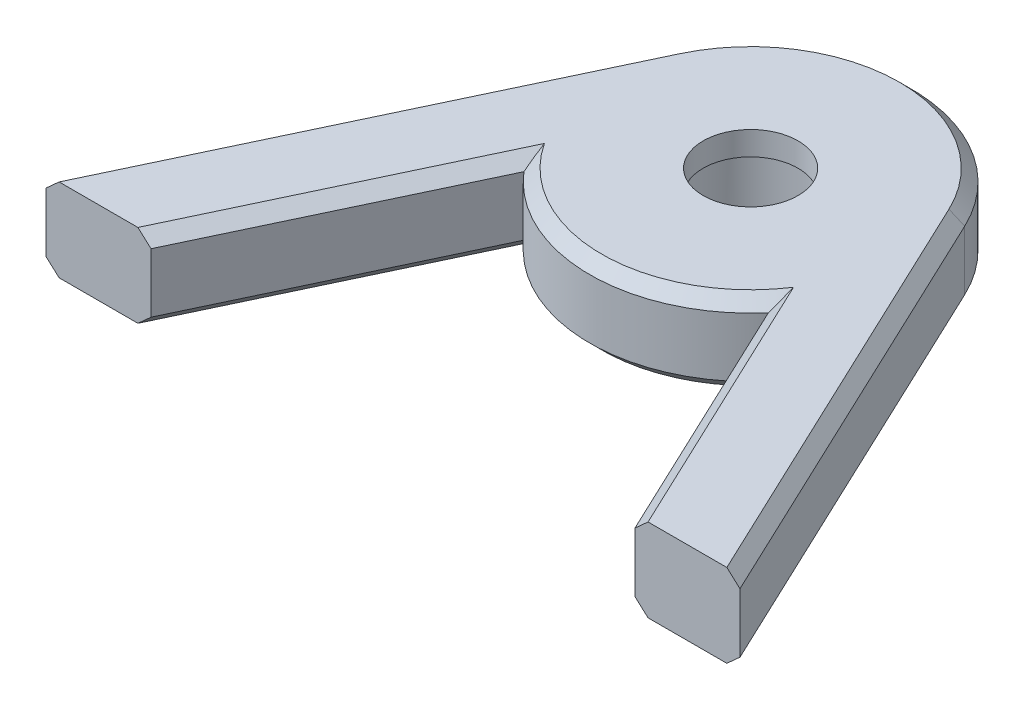
ISO-10303-21;
HEADER;
FILE_DESCRIPTION(('STEP AP214'),'2;1');
FILE_NAME('part.step','',(''),(''),'','','');
FILE_SCHEMA(('AUTOMOTIVE_DESIGN { 1 0 10303 214 1 1 1 1 }'));
ENDSEC;
DATA;
#1=APPLICATION_CONTEXT('core data for automotive mechanical design processes');
#2=APPLICATION_PROTOCOL_DEFINITION('international standard','automotive_design',2000,#1);
#3=PRODUCT_CONTEXT('',#1,'mechanical');
#4=PRODUCT('Part','Part','',(#3));
#5=PRODUCT_RELATED_PRODUCT_CATEGORY('part','',(#4));
#6=PRODUCT_DEFINITION_FORMATION('','',#4);
#7=PRODUCT_DEFINITION_CONTEXT('part definition',#1,'design');
#8=PRODUCT_DEFINITION('design','',#6,#7);
#9=PRODUCT_DEFINITION_SHAPE('','',#8);
#10=(LENGTH_UNIT() NAMED_UNIT(*) SI_UNIT(.MILLI.,.METRE.));
#11=(NAMED_UNIT(*) PLANE_ANGLE_UNIT() SI_UNIT($,.RADIAN.));
#12=(NAMED_UNIT(*) SI_UNIT($,.STERADIAN.) SOLID_ANGLE_UNIT());
#13=UNCERTAINTY_MEASURE_WITH_UNIT(LENGTH_MEASURE(1.E-05),#10,'distance_accuracy_value','');
#14=(GEOMETRIC_REPRESENTATION_CONTEXT(3) GLOBAL_UNCERTAINTY_ASSIGNED_CONTEXT((#13)) GLOBAL_UNIT_ASSIGNED_CONTEXT((#10,
#11,#12)) REPRESENTATION_CONTEXT('',''));
#15=CARTESIAN_POINT('',(0.,0.,0.));
#16=DIRECTION('',(0.,0.,1.));
#17=DIRECTION('',(1.,0.,0.));
#18=AXIS2_PLACEMENT_3D('',#15,#16,#17);
#19=CARTESIAN_POINT('',(0.,-1.,-30.15));
#20=DIRECTION('',(0.,-1.,0.));
#21=DIRECTION('',(0.,0.,-1.));
#22=AXIS2_PLACEMENT_3D('',#19,#20,#21);
#23=PLANE('',#22);
#24=CARTESIAN_POINT('',(0.,-1.,-30.15));
#25=DIRECTION('',(0.,-1.,0.));
#26=DIRECTION('',(0.,0.,-1.));
#27=AXIS2_PLACEMENT_3D('',#24,#25,#26);
#28=CIRCLE('',#27,10.);
#29=CARTESIAN_POINT('',(0.,-1.,-40.15));
#30=VERTEX_POINT('',#29);
#31=EDGE_CURVE('E281',#30,#30,#28,.T.);
#32=ORIENTED_EDGE('',*,*,#31,.F.);
#33=EDGE_LOOP('',(#32));
#34=FACE_BOUND('',#33,.T.);
#35=DIRECTION('',(0.427467380034866,0.,0.904030773262795));
#36=VECTOR('',#35,1.);
#37=CARTESIAN_POINT('',(29.3607280230666,-1.,2.57197430054442));
#38=LINE('',#37,#36);
#39=CARTESIAN_POINT('',(11.3504906025185,-1.,-35.5170346446918));
#40=VERTEX_POINT('',#39);
#41=CARTESIAN_POINT('',(28.1445801348673,-1.,0.));
#42=VERTEX_POINT('',#41);
#43=EDGE_CURVE('E339',#40,#42,#38,.T.);
#44=ORIENTED_EDGE('',*,*,#43,.T.);
#45=DIRECTION('',(-1.,0.,0.));
#46=VECTOR('',#45,1.);
#47=CARTESIAN_POINT('',(0.,-1.,0.));
#48=LINE('',#47,#46);
#49=CARTESIAN_POINT('',(21.5022350897017,-1.,0.));
#50=VERTEX_POINT('',#49);
#51=EDGE_CURVE('E565',#42,#50,#48,.T.);
#52=ORIENTED_EDGE('',*,*,#51,.T.);
#53=DIRECTION('',(-0.427467380034866,0.,-0.904030773262795));
#54=VECTOR('',#53,1.);
#55=CARTESIAN_POINT('',(11.2083510693799,-1.,-21.7700539629714));
#56=LINE('',#55,#54);
#57=CARTESIAN_POINT('',(10.5005651892905,-1.,-23.2669172240454));
#58=VERTEX_POINT('',#57);
#59=EDGE_CURVE('E349',#50,#58,#56,.T.);
#60=ORIENTED_EDGE('',*,*,#59,.T.);
#61=CARTESIAN_POINT('',(0.,-1.,-30.15));
#62=DIRECTION('',(0.,-1.,0.));
#63=DIRECTION('',(0.,0.,-1.));
#64=AXIS2_PLACEMENT_3D('',#61,#62,#63);
#65=CIRCLE('',#64,12.5554250344296);
#66=CARTESIAN_POINT('',(-10.5005651892905,-1.,-23.2669172240454));
#67=VERTEX_POINT('',#66);
#68=EDGE_CURVE('E346',#58,#67,#65,.T.);
#69=ORIENTED_EDGE('',*,*,#68,.T.);
#70=DIRECTION('',(-0.427467380034866,0.,0.904030773262795));
#71=VECTOR('',#70,1.);
#72=CARTESIAN_POINT('',(-21.3001088276339,-1.,-0.427467380034858));
#73=LINE('',#72,#71);
#74=CARTESIAN_POINT('',(-21.5022350897017,-1.,0.));
#75=VERTEX_POINT('',#74);
#76=EDGE_CURVE('E343',#67,#75,#73,.T.);
#77=ORIENTED_EDGE('',*,*,#76,.T.);
#78=CARTESIAN_POINT('',(-28.1445801348673,-1.,0.));
#79=VERTEX_POINT('',#78);
#80=EDGE_CURVE('E70',#75,#79,#48,.T.);
#81=ORIENTED_EDGE('',*,*,#80,.T.);
#82=DIRECTION('',(0.427467380034866,0.,-0.904030773262795));
#83=VECTOR('',#82,1.);
#84=CARTESIAN_POINT('',(-11.3504906025185,-1.,-35.5170346446918));
#85=LINE('',#84,#83);
#86=CARTESIAN_POINT('',(-11.3504906025185,-1.,-35.5170346446918));
#87=VERTEX_POINT('',#86);
#88=EDGE_CURVE('E333',#79,#87,#85,.T.);
#89=ORIENTED_EDGE('',*,*,#88,.T.);
#90=CARTESIAN_POINT('',(0.,-1.,-30.15));
#91=DIRECTION('',(0.,-1.,0.));
#92=DIRECTION('',(0.,0.,-1.));
#93=AXIS2_PLACEMENT_3D('',#90,#91,#92);
#94=CIRCLE('',#93,12.5554250344296);
#95=EDGE_CURVE('E336',#87,#40,#94,.T.);
#96=ORIENTED_EDGE('',*,*,#95,.T.);
#97=EDGE_LOOP('',(#44,#52,#60,#69,#77,#81,#89,#96));
#98=FACE_BOUND('',#97,.T.);
#99=ADVANCED_FACE('F46',(#34,#98),#23,.T.);
#100=CARTESIAN_POINT('',(-30.2647587963294,-1.,2.14450692050956));
#101=DIRECTION('',(0.904030773262795,0.,0.427467380034866));
#102=DIRECTION('',(0.427467380034866,0.,-0.904030773262795));
#103=AXIS2_PLACEMENT_3D('',#100,#101,#102);
#104=PLANE('',#103);
#105=DIRECTION('',(0.,-1.,0.));
#106=VECTOR('',#105,1.);
#107=CARTESIAN_POINT('',(-29.2507371701979,-1.,0.));
#108=LINE('',#107,#106);
#109=CARTESIAN_POINT('',(-29.2507371701979,4.99999999999999,0.));
#110=VERTEX_POINT('',#109);
#111=CARTESIAN_POINT('',(-29.2507371701979,0.,0.));
#112=VERTEX_POINT('',#111);
#113=EDGE_CURVE('E519',#110,#112,#108,.T.);
#114=ORIENTED_EDGE('',*,*,#113,.F.);
#115=DIRECTION('',(0.427467380034866,0.,-0.904030773262795));
#116=VECTOR('',#115,1.);
#117=CARTESIAN_POINT('',(-12.2545213757813,4.99999999999999,-35.9445020247267));
#118=LINE('',#117,#116);
#119=CARTESIAN_POINT('',(-12.2545213757813,4.99999999999999,-35.9445020247267));
#120=VERTEX_POINT('',#119);
#121=EDGE_CURVE('E446',#110,#120,#118,.T.);
#122=ORIENTED_EDGE('',*,*,#121,.T.);
#123=DIRECTION('',(0.,1.,0.));
#124=VECTOR('',#123,1.);
#125=CARTESIAN_POINT('',(-12.2545213757813,-1.,-35.9445020247267));
#126=LINE('',#125,#124);
#127=CARTESIAN_POINT('',(-12.2545213757813,0.,-35.9445020247267));
#128=VERTEX_POINT('',#127);
#129=EDGE_CURVE('E184',#128,#120,#126,.T.);
#130=ORIENTED_EDGE('',*,*,#129,.F.);
#131=DIRECTION('',(-0.427467380034866,0.,0.904030773262795));
#132=VECTOR('',#131,1.);
#133=CARTESIAN_POINT('',(-30.2647587963294,0.,2.14450692050955));
#134=LINE('',#133,#132);
#135=EDGE_CURVE('E329',#128,#112,#134,.T.);
#136=ORIENTED_EDGE('',*,*,#135,.T.);
#137=EDGE_LOOP('',(#114,#122,#130,#136));
#138=FACE_BOUND('',#137,.T.);
#139=ADVANCED_FACE('F243',(#138),#104,.F.);
#140=CARTESIAN_POINT('',(30.2647587963294,-1.,2.14450692050956));
#141=DIRECTION('',(-0.904030773262795,0.,0.427467380034866));
#142=DIRECTION('',(0.427467380034866,0.,0.904030773262795));
#143=AXIS2_PLACEMENT_3D('',#140,#141,#142);
#144=PLANE('',#143);
#145=DIRECTION('',(0.,1.,0.));
#146=VECTOR('',#145,1.);
#147=CARTESIAN_POINT('',(29.2507371701979,-1.,0.));
#148=LINE('',#147,#146);
#149=CARTESIAN_POINT('',(29.2507371701979,0.,0.));
#150=VERTEX_POINT('',#149);
#151=CARTESIAN_POINT('',(29.2507371701979,5.,0.));
#152=VERTEX_POINT('',#151);
#153=EDGE_CURVE('E276',#150,#152,#148,.T.);
#154=ORIENTED_EDGE('',*,*,#153,.F.);
#155=DIRECTION('',(-0.427467380034866,0.,-0.904030773262795));
#156=VECTOR('',#155,1.);
#157=CARTESIAN_POINT('',(12.2545213757813,0.,-35.9445020247267));
#158=LINE('',#157,#156);
#159=CARTESIAN_POINT('',(12.2545213757813,0.,-35.9445020247267));
#160=VERTEX_POINT('',#159);
#161=EDGE_CURVE('E191',#150,#160,#158,.T.);
#162=ORIENTED_EDGE('',*,*,#161,.T.);
#163=DIRECTION('',(0.,1.,0.));
#164=VECTOR('',#163,1.);
#165=CARTESIAN_POINT('',(12.2545213757813,-1.,-35.9445020247267));
#166=LINE('',#165,#164);
#167=CARTESIAN_POINT('',(12.2545213757813,4.99999999999999,-35.9445020247267));
#168=VERTEX_POINT('',#167);
#169=EDGE_CURVE('E313',#160,#168,#166,.T.);
#170=ORIENTED_EDGE('',*,*,#169,.T.);
#171=DIRECTION('',(0.427467380034866,0.,0.904030773262795));
#172=VECTOR('',#171,1.);
#173=CARTESIAN_POINT('',(29.2507371701979,4.99999999999999,0.));
#174=LINE('',#173,#172);
#175=EDGE_CURVE('E447',#168,#152,#174,.T.);
#176=ORIENTED_EDGE('',*,*,#175,.T.);
#177=EDGE_LOOP('',(#154,#162,#170,#176));
#178=FACE_BOUND('',#177,.T.);
#179=ADVANCED_FACE('F251',(#178),#144,.F.);
#180=CARTESIAN_POINT('',(11.3504906025185,-1.,-35.5170346446918));
#181=DIRECTION('',(0.639246290175441,-0.707106781186547,-0.302265083158701));
#182=DIRECTION('',(-0.427467380034866,0.,-0.904030773262795));
#183=AXIS2_PLACEMENT_3D('',#180,#181,#182);
#184=PLANE('',#183);
#185=ORIENTED_EDGE('',*,*,#161,.F.);
#186=DIRECTION('',(-0.741805545341281,-0.670615040765508,0.));
#187=VECTOR('',#186,1.);
#188=CARTESIAN_POINT('',(18.9032046729504,-9.35448780484863,0.));
#189=LINE('',#188,#187);
#190=EDGE_CURVE('E283',#150,#42,#189,.T.);
#191=ORIENTED_EDGE('',*,*,#190,.T.);
#192=ORIENTED_EDGE('',*,*,#43,.F.);
#193=DIRECTION('',(-0.639246290175441,-0.707106781186548,0.3022650831587));
#194=VECTOR('',#193,1.);
#195=CARTESIAN_POINT('',(12.2545213757813,0.,-35.9445020247267));
#196=LINE('',#195,#194);
#197=EDGE_CURVE('E206',#160,#40,#196,.T.);
#198=ORIENTED_EDGE('',*,*,#197,.F.);
#199=EDGE_LOOP('',(#185,#191,#192,#198));
#200=FACE_BOUND('',#199,.T.);
#201=ADVANCED_FACE('F416',(#200),#184,.T.);
#202=CARTESIAN_POINT('',(-11.3504906025185,-1.,-35.5170346446918));
#203=DIRECTION('',(-0.639246290175441,-0.707106781186547,-0.302265083158701));
#204=DIRECTION('',(-0.427467380034866,0.,0.904030773262795));
#205=AXIS2_PLACEMENT_3D('',#202,#203,#204);
#206=PLANE('',#205);
#207=ORIENTED_EDGE('',*,*,#88,.F.);
#208=DIRECTION('',(-0.741805545341281,0.670615040765508,0.));
#209=VECTOR('',#208,1.);
#210=CARTESIAN_POINT('',(-18.9032046729504,-9.35448780484863,0.));
#211=LINE('',#210,#209);
#212=EDGE_CURVE('E525',#79,#112,#211,.T.);
#213=ORIENTED_EDGE('',*,*,#212,.T.);
#214=ORIENTED_EDGE('',*,*,#135,.F.);
#215=DIRECTION('',(0.63924629017544,-0.707106781186548,0.3022650831587));
#216=VECTOR('',#215,1.);
#217=CARTESIAN_POINT('',(-12.2545213757813,0.,-35.9445020247267));
#218=LINE('',#217,#216);
#219=EDGE_CURVE('E202',#128,#87,#218,.T.);
#220=ORIENTED_EDGE('',*,*,#219,.T.);
#221=EDGE_LOOP('',(#207,#213,#214,#220));
#222=FACE_BOUND('',#221,.T.);
#223=ADVANCED_FACE('F411',(#222),#206,.T.);
#224=CARTESIAN_POINT('',(5.92189038061173,-1.,-32.9501424738203));
#225=DIRECTION('',(-0.639246290175445,-0.707106781186543,0.302265083158703));
#226=DIRECTION('',(0.427467380034866,0.,0.904030773262795));
#227=AXIS2_PLACEMENT_3D('',#224,#225,#226);
#228=PLANE('',#227);
#229=ORIENTED_EDGE('',*,*,#59,.F.);
#230=DIRECTION('',(-0.741805545341277,0.670615040765513,0.));
#231=VECTOR('',#230,1.);
#232=CARTESIAN_POINT('',(12.9287536273427,6.75069107597076,0.));
#233=LINE('',#232,#231);
#234=CARTESIAN_POINT('',(20.3960780543712,0.,0.));
#235=VERTEX_POINT('',#234);
#236=EDGE_CURVE('E524',#50,#235,#233,.T.);
#237=ORIENTED_EDGE('',*,*,#236,.T.);
#238=DIRECTION('',(0.427467380034866,0.,0.904030773262795));
#239=VECTOR('',#238,1.);
#240=CARTESIAN_POINT('',(20.3960780543712,0.,0.));
#241=LINE('',#240,#239);
#242=CARTESIAN_POINT('',(10.3043202961172,0.,-21.3425865829366));
#243=VERTEX_POINT('',#242);
#244=EDGE_CURVE('E11',#243,#235,#241,.T.);
#245=ORIENTED_EDGE('',*,*,#244,.F.);
#246=CARTESIAN_POINT('',(10.3043202961172,0.,-21.3425865829366));
#247=CARTESIAN_POINT('',(10.3254338543777,-0.0866665754563658,-21.5006788075415));
#248=CARTESIAN_POINT('',(10.3454332905183,-0.172569648524016,-21.6593411301335));
#249=CARTESIAN_POINT('',(10.3830859963499,-0.342722987591227,-21.9777610626386));
#250=CARTESIAN_POINT('',(10.4007399999005,-0.426973763509953,-22.1375183134307));
#251=CARTESIAN_POINT('',(10.4335978145244,-0.593753792612386,-22.4581873514497));
#252=CARTESIAN_POINT('',(10.4488015491824,-0.676282992036298,-22.6190991745202));
#253=CARTESIAN_POINT('',(10.4766415478909,-0.83953276082195,-22.9421216077507));
#254=CARTESIAN_POINT('',(10.489277004891,-0.920252754594745,-23.1042325781944));
#255=CARTESIAN_POINT('',(10.5005651892905,-1.,-23.2669172240454));
#256=B_SPLINE_CURVE_WITH_KNOTS('',3,(#246,#247,#248,#249,#250,#251,#252,#253,#254,#255),
.UNSPECIFIED.,.F.,.F.,(4,2,2,2,4),(0.,0.544561813912758,1.08895283723208,1.63336083491792,
2.17793964271018),.UNSPECIFIED.);
#257=EDGE_CURVE('E52',#58,#243,#256,.F.);
#258=ORIENTED_EDGE('',*,*,#257,.F.);
#259=EDGE_LOOP('',(#229,#237,#245,#258));
#260=FACE_BOUND('',#259,.T.);
#261=ADVANCED_FACE('F49',(#260),#228,.T.);
#262=CARTESIAN_POINT('',(-5.92189038061173,-1.,-32.9501424738203));
#263=DIRECTION('',(0.639246290175445,-0.707106781186543,0.302265083158703));
#264=DIRECTION('',(0.427467380034866,0.,-0.904030773262795));
#265=AXIS2_PLACEMENT_3D('',#262,#263,#264);
#266=PLANE('',#265);
#267=DIRECTION('',(0.427467380034866,0.,-0.904030773262795));
#268=VECTOR('',#267,1.);
#269=CARTESIAN_POINT('',(-10.3043202961172,0.,-21.3425865829366));
#270=LINE('',#269,#268);
#271=CARTESIAN_POINT('',(-20.3960780543712,0.,0.));
#272=VERTEX_POINT('',#271);
#273=CARTESIAN_POINT('',(-10.3043202961171,0.,-21.3425865829365));
#274=VERTEX_POINT('',#273);
#275=EDGE_CURVE('E178',#272,#274,#270,.T.);
#276=ORIENTED_EDGE('',*,*,#275,.F.);
#277=DIRECTION('',(-0.741805545341277,-0.670615040765513,0.));
#278=VECTOR('',#277,1.);
#279=CARTESIAN_POINT('',(-12.9287536273427,6.75069107597076,0.));
#280=LINE('',#279,#278);
#281=EDGE_CURVE('E165',#272,#75,#280,.T.);
#282=ORIENTED_EDGE('',*,*,#281,.T.);
#283=ORIENTED_EDGE('',*,*,#76,.F.);
#284=CARTESIAN_POINT('',(-10.3043202961171,0.,-21.3425865829365));
#285=CARTESIAN_POINT('',(-10.3254338543777,-0.086666575456364,-21.5006788075415));
#286=CARTESIAN_POINT('',(-10.3454332905183,-0.172569648524014,-21.6593411301335));
#287=CARTESIAN_POINT('',(-10.3830859963499,-0.342722987591224,-21.9777610626386));
#288=CARTESIAN_POINT('',(-10.4007399999005,-0.426973763509951,-22.1375183134307));
#289=CARTESIAN_POINT('',(-10.4335978145244,-0.593753792612384,-22.4581873514497));
#290=CARTESIAN_POINT('',(-10.4488015491824,-0.676282992036297,-22.6190991745202));
#291=CARTESIAN_POINT('',(-10.4766415478909,-0.83953276082195,-22.9421216077507));
#292=CARTESIAN_POINT('',(-10.489277004891,-0.920252754594746,-23.1042325781944));
#293=CARTESIAN_POINT('',(-10.5005651892905,-1.,-23.2669172240454));
#294=B_SPLINE_CURVE_WITH_KNOTS('',3,(#284,#285,#286,#287,#288,#289,#290,#291,#292,#293),
.UNSPECIFIED.,.F.,.F.,(4,2,2,2,4),(0.,0.544561813912757,1.08895283723209,1.63336083491793,
2.17793964271019),.UNSPECIFIED.);
#295=EDGE_CURVE('E189',#67,#274,#294,.F.);
#296=ORIENTED_EDGE('',*,*,#295,.T.);
#297=EDGE_LOOP('',(#276,#282,#283,#296));
#298=FACE_BOUND('',#297,.T.);
#299=ADVANCED_FACE('F187',(#298),#266,.T.);
#300=CARTESIAN_POINT('',(0.,-1.,-30.15));
#301=DIRECTION('',(0.,-1.,0.));
#302=DIRECTION('',(0.,0.,-1.));
#303=AXIS2_PLACEMENT_3D('',#300,#301,#302);
#304=CIRCLE('',#303,5.);
#305=CARTESIAN_POINT('',(0.,-1.,-35.15));
#306=VERTEX_POINT('',#305);
#307=EDGE_CURVE('E269',#306,#306,#304,.T.);
#308=ORIENTED_EDGE('',*,*,#307,.F.);
#309=EDGE_LOOP('',(#308));
#310=FACE_BOUND('',#309,.T.);
#311=CARTESIAN_POINT('',(0.,-1.,-30.15));
#312=DIRECTION('',(0.,-1.,0.));
#313=DIRECTION('',(0.,0.,-1.));
#314=AXIS2_PLACEMENT_3D('',#311,#312,#313);
#315=CIRCLE('',#314,6.);
#316=CARTESIAN_POINT('',(0.,-1.,-36.15));
#317=VERTEX_POINT('',#316);
#318=EDGE_CURVE('E272',#317,#317,#315,.T.);
#319=ORIENTED_EDGE('',*,*,#318,.T.);
#320=EDGE_LOOP('',(#319));
#321=FACE_BOUND('',#320,.T.);
#322=ADVANCED_FACE('F246',(#310,#321),#23,.T.);
#323=CARTESIAN_POINT('',(0.,-1.,-30.15));
#324=DIRECTION('',(0.,1.,0.));
#325=DIRECTION('',(0.,0.,1.));
#326=AXIS2_PLACEMENT_3D('',#323,#324,#325);
#327=CYLINDRICAL_SURFACE('',#326,5.);
#328=ORIENTED_EDGE('',*,*,#307,.T.);
#329=EDGE_LOOP('',(#328));
#330=FACE_BOUND('',#329,.T.);
#331=CARTESIAN_POINT('',(0.,4.,-30.15));
#332=DIRECTION('',(0.,1.,0.));
#333=DIRECTION('',(0.,0.,1.));
#334=AXIS2_PLACEMENT_3D('',#331,#332,#333);
#335=CIRCLE('',#334,5.);
#336=CARTESIAN_POINT('',(0.,4.,-25.15));
#337=VERTEX_POINT('',#336);
#338=EDGE_CURVE('E310',#337,#337,#335,.T.);
#339=ORIENTED_EDGE('',*,*,#338,.T.);
#340=EDGE_LOOP('',(#339));
#341=FACE_BOUND('',#340,.T.);
#342=ADVANCED_FACE('F258',(#330,#341),#327,.F.);
#343=CARTESIAN_POINT('',(20.3960780543712,-1.,0.));
#344=DIRECTION('',(0.904030773262795,0.,-0.427467380034866));
#345=DIRECTION('',(-0.427467380034866,0.,-0.904030773262795));
#346=AXIS2_PLACEMENT_3D('',#343,#344,#345);
#347=PLANE('',#346);
#348=DIRECTION('',(0.,1.,0.));
#349=VECTOR('',#348,1.);
#350=CARTESIAN_POINT('',(10.3043202961172,-1.,-21.3425865829366));
#351=LINE('',#350,#349);
#352=CARTESIAN_POINT('',(10.3043202961172,5.00000000000001,-21.3425865829366));
#353=VERTEX_POINT('',#352);
#354=EDGE_CURVE('E320',#243,#353,#351,.T.);
#355=ORIENTED_EDGE('',*,*,#354,.F.);
#356=ORIENTED_EDGE('',*,*,#244,.T.);
#357=DIRECTION('',(0.,1.,0.));
#358=VECTOR('',#357,1.);
#359=CARTESIAN_POINT('',(20.3960780543712,-1.,0.));
#360=LINE('',#359,#358);
#361=CARTESIAN_POINT('',(20.3960780543711,5.,0.));
#362=VERTEX_POINT('',#361);
#363=EDGE_CURVE('E199',#235,#362,#360,.T.);
#364=ORIENTED_EDGE('',*,*,#363,.T.);
#365=DIRECTION('',(-0.427467380034866,0.,-0.904030773262795));
#366=VECTOR('',#365,1.);
#367=CARTESIAN_POINT('',(10.3043202961172,5.00000000000001,-21.3425865829366));
#368=LINE('',#367,#366);
#369=EDGE_CURVE('E454',#362,#353,#368,.T.);
#370=ORIENTED_EDGE('',*,*,#369,.T.);
#371=EDGE_LOOP('',(#355,#356,#364,#370));
#372=FACE_BOUND('',#371,.T.);
#373=ADVANCED_FACE('F263',(#372),#347,.F.);
#374=CARTESIAN_POINT('',(0.,-1.,-30.15));
#375=DIRECTION('',(0.,1.,0.));
#376=DIRECTION('',(0.,0.,1.));
#377=AXIS2_PLACEMENT_3D('',#374,#375,#376);
#378=CYLINDRICAL_SURFACE('',#377,13.5554250344296);
#379=DIRECTION('',(0.,1.,0.));
#380=VECTOR('',#379,1.);
#381=CARTESIAN_POINT('',(-10.3043202961171,-1.,-21.3425865829365));
#382=LINE('',#381,#380);
#383=CARTESIAN_POINT('',(-10.3043202961171,5.00000000000001,-21.3425865829365));
#384=VERTEX_POINT('',#383);
#385=EDGE_CURVE('E183',#274,#384,#382,.T.);
#386=ORIENTED_EDGE('',*,*,#385,.F.);
#387=CARTESIAN_POINT('',(0.,0.,-30.15));
#388=DIRECTION('',(0.,-1.,0.));
#389=DIRECTION('',(0.,0.,-1.));
#390=AXIS2_PLACEMENT_3D('',#387,#388,#389);
#391=CIRCLE('',#390,13.5554250344296);
#392=EDGE_CURVE('E62',#274,#243,#391,.F.);
#393=ORIENTED_EDGE('',*,*,#392,.T.);
#394=ORIENTED_EDGE('',*,*,#354,.T.);
#395=CARTESIAN_POINT('',(0.,5.00000000000001,-30.15));
#396=DIRECTION('',(0.,1.,0.));
#397=DIRECTION('',(0.,0.,1.));
#398=AXIS2_PLACEMENT_3D('',#395,#396,#397);
#399=CIRCLE('',#398,13.5554250344296);
#400=EDGE_CURVE('E484',#353,#384,#399,.F.);
#401=ORIENTED_EDGE('',*,*,#400,.T.);
#402=EDGE_LOOP('',(#386,#393,#394,#401));
#403=FACE_BOUND('',#402,.T.);
#404=ADVANCED_FACE('F600',(#403),#378,.T.);
#405=CARTESIAN_POINT('',(-20.3960780543712,-1.,0.));
#406=DIRECTION('',(-0.904030773262795,0.,-0.427467380034866));
#407=DIRECTION('',(-0.427467380034866,0.,0.904030773262795));
#408=AXIS2_PLACEMENT_3D('',#405,#406,#407);
#409=PLANE('',#408);
#410=DIRECTION('',(0.,1.,0.));
#411=VECTOR('',#410,1.);
#412=CARTESIAN_POINT('',(-20.3960780543712,-1.,0.));
#413=LINE('',#412,#411);
#414=CARTESIAN_POINT('',(-20.3960780543712,5.,0.));
#415=VERTEX_POINT('',#414);
#416=EDGE_CURVE('E168',#272,#415,#413,.T.);
#417=ORIENTED_EDGE('',*,*,#416,.F.);
#418=ORIENTED_EDGE('',*,*,#275,.T.);
#419=ORIENTED_EDGE('',*,*,#385,.T.);
#420=DIRECTION('',(-0.427467380034866,0.,0.904030773262795));
#421=VECTOR('',#420,1.);
#422=CARTESIAN_POINT('',(-20.3960780543712,5.00000000000001,0.));
#423=LINE('',#422,#421);
#424=EDGE_CURVE('E180',#384,#415,#423,.T.);
#425=ORIENTED_EDGE('',*,*,#424,.T.);
#426=EDGE_LOOP('',(#417,#418,#419,#425));
#427=FACE_BOUND('',#426,.T.);
#428=ADVANCED_FACE('F177',(#427),#409,.F.);
#429=CARTESIAN_POINT('',(0.,-1.,-30.15));
#430=DIRECTION('',(0.,1.,0.));
#431=DIRECTION('',(0.,0.,1.));
#432=AXIS2_PLACEMENT_3D('',#429,#430,#431);
#433=CYLINDRICAL_SURFACE('',#432,13.5554250344296);
#434=ORIENTED_EDGE('',*,*,#169,.F.);
#435=CARTESIAN_POINT('',(0.,0.,-30.15));
#436=DIRECTION('',(0.,-1.,0.));
#437=DIRECTION('',(0.,0.,-1.));
#438=AXIS2_PLACEMENT_3D('',#435,#436,#437);
#439=CIRCLE('',#438,13.5554250344296);
#440=EDGE_CURVE('E196',#160,#128,#439,.F.);
#441=ORIENTED_EDGE('',*,*,#440,.T.);
#442=ORIENTED_EDGE('',*,*,#129,.T.);
#443=CARTESIAN_POINT('',(0.,4.99999999999999,-30.15));
#444=DIRECTION('',(0.,1.,0.));
#445=DIRECTION('',(0.,0.,1.));
#446=AXIS2_PLACEMENT_3D('',#443,#444,#445);
#447=CIRCLE('',#446,13.5554250344296);
#448=EDGE_CURVE('E441',#120,#168,#447,.F.);
#449=ORIENTED_EDGE('',*,*,#448,.T.);
#450=EDGE_LOOP('',(#434,#441,#442,#449));
#451=FACE_BOUND('',#450,.T.);
#452=ADVANCED_FACE('F438',(#451),#433,.T.);
#453=CARTESIAN_POINT('',(0.,4.,-30.15));
#454=DIRECTION('',(0.,1.,0.));
#455=DIRECTION('',(0.,0.,1.));
#456=AXIS2_PLACEMENT_3D('',#453,#454,#455);
#457=PLANE('',#456);
#458=CARTESIAN_POINT('',(0.,4.,-30.15));
#459=DIRECTION('',(0.,1.,0.));
#460=DIRECTION('',(0.,0.,1.));
#461=AXIS2_PLACEMENT_3D('',#458,#459,#460);
#462=CIRCLE('',#461,4.);
#463=CARTESIAN_POINT('',(0.,4.,-26.15));
#464=VERTEX_POINT('',#463);
#465=EDGE_CURVE('E306',#464,#464,#462,.T.);
#466=ORIENTED_EDGE('',*,*,#465,.T.);
#467=EDGE_LOOP('',(#466));
#468=FACE_BOUND('',#467,.T.);
#469=ORIENTED_EDGE('',*,*,#338,.F.);
#470=EDGE_LOOP('',(#469));
#471=FACE_BOUND('',#470,.T.);
#472=ADVANCED_FACE('F535',(#468,#471),#457,.F.);
#473=CARTESIAN_POINT('',(0.,4.,-30.15));
#474=DIRECTION('',(0.,1.,0.));
#475=DIRECTION('',(0.,0.,1.));
#476=AXIS2_PLACEMENT_3D('',#473,#474,#475);
#477=CYLINDRICAL_SURFACE('',#476,4.);
#478=ORIENTED_EDGE('',*,*,#465,.F.);
#479=EDGE_LOOP('',(#478));
#480=FACE_BOUND('',#479,.T.);
#481=CARTESIAN_POINT('',(0.,6.,-30.15));
#482=DIRECTION('',(0.,1.,0.));
#483=DIRECTION('',(0.,0.,1.));
#484=AXIS2_PLACEMENT_3D('',#481,#482,#483);
#485=CIRCLE('',#484,4.);
#486=CARTESIAN_POINT('',(0.,6.,-26.15));
#487=VERTEX_POINT('',#486);
#488=EDGE_CURVE('E293',#487,#487,#485,.T.);
#489=ORIENTED_EDGE('',*,*,#488,.T.);
#490=EDGE_LOOP('',(#489));
#491=FACE_BOUND('',#490,.T.);
#492=ADVANCED_FACE('F537',(#480,#491),#477,.F.);
#493=CARTESIAN_POINT('',(0.,6.,-30.15));
#494=DIRECTION('',(0.,1.,0.));
#495=DIRECTION('',(0.,0.,1.));
#496=AXIS2_PLACEMENT_3D('',#493,#494,#495);
#497=PLANE('',#496);
#498=DIRECTION('',(1.,0.,0.));
#499=VECTOR('',#498,1.);
#500=CARTESIAN_POINT('',(-29.2507371701979,6.,0.));
#501=LINE('',#500,#499);
#502=CARTESIAN_POINT('',(-28.1445801348673,6.,0.));
#503=VERTEX_POINT('',#502);
#504=CARTESIAN_POINT('',(-21.5022350897017,6.,0.));
#505=VERTEX_POINT('',#504);
#506=EDGE_CURVE('E302',#503,#505,#501,.T.);
#507=ORIENTED_EDGE('',*,*,#506,.T.);
#508=DIRECTION('',(0.427467380034866,0.,-0.904030773262795));
#509=VECTOR('',#508,1.);
#510=CARTESIAN_POINT('',(-11.2083510693799,6.,-21.7700539629714));
#511=LINE('',#510,#509);
#512=CARTESIAN_POINT('',(-10.5005651892905,6.,-23.2669172240454));
#513=VERTEX_POINT('',#512);
#514=EDGE_CURVE('E478',#505,#513,#511,.T.);
#515=ORIENTED_EDGE('',*,*,#514,.T.);
#516=CARTESIAN_POINT('',(0.,6.,-30.15));
#517=DIRECTION('',(0.,1.,0.));
#518=DIRECTION('',(0.,0.,1.));
#519=AXIS2_PLACEMENT_3D('',#516,#517,#518);
#520=CIRCLE('',#519,12.5554250344296);
#521=CARTESIAN_POINT('',(10.5005651892905,6.,-23.2669172240454));
#522=VERTEX_POINT('',#521);
#523=EDGE_CURVE('E472',#513,#522,#520,.T.);
#524=ORIENTED_EDGE('',*,*,#523,.T.);
#525=DIRECTION('',(0.427467380034866,0.,0.904030773262795));
#526=VECTOR('',#525,1.);
#527=CARTESIAN_POINT('',(21.3001088276339,6.,-0.427467380034858));
#528=LINE('',#527,#526);
#529=CARTESIAN_POINT('',(21.5022350897017,6.,0.));
#530=VERTEX_POINT('',#529);
#531=EDGE_CURVE('E469',#522,#530,#528,.T.);
#532=ORIENTED_EDGE('',*,*,#531,.T.);
#533=DIRECTION('',(1.,0.,0.));
#534=VECTOR('',#533,1.);
#535=CARTESIAN_POINT('',(20.3960780543712,6.,0.));
#536=LINE('',#535,#534);
#537=CARTESIAN_POINT('',(28.1445801348673,6.,0.));
#538=VERTEX_POINT('',#537);
#539=EDGE_CURVE('E297',#530,#538,#536,.T.);
#540=ORIENTED_EDGE('',*,*,#539,.T.);
#541=DIRECTION('',(-0.427467380034866,0.,-0.904030773262795));
#542=VECTOR('',#541,1.);
#543=CARTESIAN_POINT('',(11.3504906025185,6.,-35.5170346446918));
#544=LINE('',#543,#542);
#545=CARTESIAN_POINT('',(11.3504906025185,6.,-35.5170346446918));
#546=VERTEX_POINT('',#545);
#547=EDGE_CURVE('E463',#538,#546,#544,.T.);
#548=ORIENTED_EDGE('',*,*,#547,.T.);
#549=CARTESIAN_POINT('',(0.,6.,-30.15));
#550=DIRECTION('',(0.,1.,0.));
#551=DIRECTION('',(0.,0.,1.));
#552=AXIS2_PLACEMENT_3D('',#549,#550,#551);
#553=CIRCLE('',#552,12.5554250344296);
#554=CARTESIAN_POINT('',(-11.3504906025185,6.,-35.5170346446918));
#555=VERTEX_POINT('',#554);
#556=EDGE_CURVE('E456',#546,#555,#553,.T.);
#557=ORIENTED_EDGE('',*,*,#556,.T.);
#558=DIRECTION('',(-0.427467380034866,0.,0.904030773262795));
#559=VECTOR('',#558,1.);
#560=CARTESIAN_POINT('',(-28.3467063969351,6.,0.427467380034869));
#561=LINE('',#560,#559);
#562=EDGE_CURVE('E464',#555,#503,#561,.T.);
#563=ORIENTED_EDGE('',*,*,#562,.T.);
#564=EDGE_LOOP('',(#507,#515,#524,#532,#540,#548,#557,#563));
#565=FACE_BOUND('',#564,.T.);
#566=ORIENTED_EDGE('',*,*,#488,.F.);
#567=EDGE_LOOP('',(#566));
#568=FACE_BOUND('',#567,.T.);
#569=ADVANCED_FACE('F385',(#565,#568),#497,.T.);
#570=CARTESIAN_POINT('',(5.92189038061173,6.,-32.9501424738203));
#571=DIRECTION('',(-0.639246290175445,0.707106781186543,0.302265083158703));
#572=DIRECTION('',(-0.427467380034866,0.,-0.904030773262795));
#573=AXIS2_PLACEMENT_3D('',#570,#571,#572);
#574=PLANE('',#573);
#575=DIRECTION('',(-0.741805545341277,-0.670615040765513,0.));
#576=VECTOR('',#575,1.);
#577=CARTESIAN_POINT('',(6.68528689586737,-7.39497713306703,0.));
#578=LINE('',#577,#576);
#579=EDGE_CURVE('E504',#530,#362,#578,.T.);
#580=ORIENTED_EDGE('',*,*,#579,.F.);
#581=ORIENTED_EDGE('',*,*,#531,.F.);
#582=CARTESIAN_POINT('',(10.5005651892905,6.,-23.2669172240454));
#583=CARTESIAN_POINT('',(10.489277004891,5.92025275459475,-23.1042325781944));
#584=CARTESIAN_POINT('',(10.4766415478909,5.83953276082195,-22.9421216077507));
#585=CARTESIAN_POINT('',(10.4488015491824,5.6762829920363,-22.6190991745202));
#586=CARTESIAN_POINT('',(10.4335978145244,5.59375379261239,-22.4581873514497));
#587=CARTESIAN_POINT('',(10.4007399999005,5.42697376350995,-22.1375183134307));
#588=CARTESIAN_POINT('',(10.3830859963499,5.34272298759123,-21.9777610626386));
#589=CARTESIAN_POINT('',(10.3454332905183,5.17256964852402,-21.6593411301335));
#590=CARTESIAN_POINT('',(10.3254338543777,5.08666657545637,-21.5006788075415));
#591=CARTESIAN_POINT('',(10.3043202961172,5.00000000000001,-21.3425865829366));
#592=B_SPLINE_CURVE_WITH_KNOTS('',3,(#582,#583,#584,#585,#586,#587,#588,#589,#590,#591),
.UNSPECIFIED.,.F.,.F.,(4,2,2,2,4),(0.,0.544578807792256,1.0889868054781,1.63337782879742,
2.17793964271018),.UNSPECIFIED.);
#593=EDGE_CURVE('E298',#353,#522,#592,.F.);
#594=ORIENTED_EDGE('',*,*,#593,.F.);
#595=ORIENTED_EDGE('',*,*,#369,.F.);
#596=EDGE_LOOP('',(#580,#581,#594,#595));
#597=FACE_BOUND('',#596,.T.);
#598=ADVANCED_FACE('F379',(#597),#574,.T.);
#599=CARTESIAN_POINT('',(0.,6.,-30.15));
#600=DIRECTION('',(0.,-1.,0.));
#601=DIRECTION('',(0.,0.,-1.));
#602=AXIS2_PLACEMENT_3D('',#599,#600,#601);
#603=CONICAL_SURFACE('',#602,12.5554250344296,0.785398163397442);
#604=ORIENTED_EDGE('',*,*,#593,.T.);
#605=ORIENTED_EDGE('',*,*,#523,.F.);
#606=CARTESIAN_POINT('',(-10.5005651892905,6.,-23.2669172240454));
#607=CARTESIAN_POINT('',(-10.489277004891,5.92025275459475,-23.1042325781944));
#608=CARTESIAN_POINT('',(-10.4766415478909,5.83953276082195,-22.9421216077507));
#609=CARTESIAN_POINT('',(-10.4488015491824,5.6762829920363,-22.6190991745202));
#610=CARTESIAN_POINT('',(-10.4335978145244,5.59375379261238,-22.4581873514497));
#611=CARTESIAN_POINT('',(-10.4007399999005,5.42697376350995,-22.1375183134307));
#612=CARTESIAN_POINT('',(-10.3830859963499,5.34272298759123,-21.9777610626386));
#613=CARTESIAN_POINT('',(-10.3454332905183,5.17256964852402,-21.6593411301335));
#614=CARTESIAN_POINT('',(-10.3254338543777,5.08666657545637,-21.5006788075415));
#615=CARTESIAN_POINT('',(-10.3043202961172,5.,-21.3425865829366));
#616=B_SPLINE_CURVE_WITH_KNOTS('',3,(#606,#607,#608,#609,#610,#611,#612,#613,#614,#615),
.UNSPECIFIED.,.F.,.F.,(4,2,2,2,4),(0.,0.544578807792256,1.0889868054781,1.63337782879742,
2.17793964271018),.UNSPECIFIED.);
#617=EDGE_CURVE('E357',#384,#513,#616,.F.);
#618=ORIENTED_EDGE('',*,*,#617,.F.);
#619=ORIENTED_EDGE('',*,*,#400,.F.);
#620=EDGE_LOOP('',(#604,#605,#618,#619));
#621=FACE_BOUND('',#620,.T.);
#622=ADVANCED_FACE('F376',(#621),#603,.T.);
#623=CARTESIAN_POINT('',(-5.92189038061173,6.,-32.9501424738203));
#624=DIRECTION('',(0.639246290175445,0.707106781186543,0.302265083158703));
#625=DIRECTION('',(-0.427467380034866,0.,0.904030773262795));
#626=AXIS2_PLACEMENT_3D('',#623,#624,#625);
#627=PLANE('',#626);
#628=DIRECTION('',(-0.741805545341277,0.670615040765513,0.));
#629=VECTOR('',#628,1.);
#630=CARTESIAN_POINT('',(-6.68528689586737,-7.39497713306703,0.));
#631=LINE('',#630,#629);
#632=EDGE_CURVE('E499',#415,#505,#631,.T.);
#633=ORIENTED_EDGE('',*,*,#632,.F.);
#634=ORIENTED_EDGE('',*,*,#424,.F.);
#635=ORIENTED_EDGE('',*,*,#617,.T.);
#636=ORIENTED_EDGE('',*,*,#514,.F.);
#637=EDGE_LOOP('',(#633,#634,#635,#636));
#638=FACE_BOUND('',#637,.T.);
#639=ADVANCED_FACE('F408',(#638),#627,.T.);
#640=CARTESIAN_POINT('',(-11.3504906025185,6.,-35.5170346446918));
#641=DIRECTION('',(-0.639246290175443,0.707106781186545,-0.302265083158702));
#642=DIRECTION('',(0.427467380034866,0.,-0.904030773262795));
#643=AXIS2_PLACEMENT_3D('',#640,#641,#642);
#644=PLANE('',#643);
#645=DIRECTION('',(-0.741805545341279,-0.670615040765511,0.));
#646=VECTOR('',#645,1.);
#647=CARTESIAN_POINT('',(-15.6421038910207,17.3026232664245,0.));
#648=LINE('',#647,#646);
#649=EDGE_CURVE('E352',#503,#110,#648,.T.);
#650=ORIENTED_EDGE('',*,*,#649,.F.);
#651=ORIENTED_EDGE('',*,*,#562,.F.);
#652=DIRECTION('',(0.639246290175439,0.70710678118655,0.302265083158699));
#653=VECTOR('',#652,1.);
#654=CARTESIAN_POINT('',(-12.2545213757813,4.99999999999999,-35.9445020247267));
#655=LINE('',#654,#653);
#656=EDGE_CURVE('E353',#120,#555,#655,.T.);
#657=ORIENTED_EDGE('',*,*,#656,.F.);
#658=ORIENTED_EDGE('',*,*,#121,.F.);
#659=EDGE_LOOP('',(#650,#651,#657,#658));
#660=FACE_BOUND('',#659,.T.);
#661=ADVANCED_FACE('F401',(#660),#644,.T.);
#662=CARTESIAN_POINT('',(0.,6.,-30.15));
#663=DIRECTION('',(0.,-1.,0.));
#664=DIRECTION('',(0.,0.,-1.));
#665=AXIS2_PLACEMENT_3D('',#662,#663,#664);
#666=CONICAL_SURFACE('',#665,12.5554250344296,0.785398163397446);
#667=ORIENTED_EDGE('',*,*,#656,.T.);
#668=ORIENTED_EDGE('',*,*,#556,.F.);
#669=DIRECTION('',(-0.63924629017544,0.707106781186549,0.302265083158699));
#670=VECTOR('',#669,1.);
#671=CARTESIAN_POINT('',(12.2545213757813,4.99999999999999,-35.9445020247267));
#672=LINE('',#671,#670);
#673=EDGE_CURVE('E209',#168,#546,#672,.T.);
#674=ORIENTED_EDGE('',*,*,#673,.F.);
#675=ORIENTED_EDGE('',*,*,#448,.F.);
#676=EDGE_LOOP('',(#667,#668,#674,#675));
#677=FACE_BOUND('',#676,.T.);
#678=ADVANCED_FACE('F394',(#677),#666,.T.);
#679=CARTESIAN_POINT('',(11.3504906025185,6.,-35.5170346446918));
#680=DIRECTION('',(0.639246290175443,0.707106781186545,-0.302265083158702));
#681=DIRECTION('',(0.427467380034866,0.,0.904030773262795));
#682=AXIS2_PLACEMENT_3D('',#679,#680,#681);
#683=PLANE('',#682);
#684=DIRECTION('',(-0.741805545341279,0.670615040765511,0.));
#685=VECTOR('',#684,1.);
#686=CARTESIAN_POINT('',(15.6421038910207,17.3026232664245,0.));
#687=LINE('',#686,#685);
#688=EDGE_CURVE('E452',#152,#538,#687,.T.);
#689=ORIENTED_EDGE('',*,*,#688,.F.);
#690=ORIENTED_EDGE('',*,*,#175,.F.);
#691=ORIENTED_EDGE('',*,*,#673,.T.);
#692=ORIENTED_EDGE('',*,*,#547,.F.);
#693=EDGE_LOOP('',(#689,#690,#691,#692));
#694=FACE_BOUND('',#693,.T.);
#695=ADVANCED_FACE('F238',(#694),#683,.T.);
#696=CARTESIAN_POINT('',(0.,-1.,-30.15));
#697=DIRECTION('',(0.,1.,0.));
#698=DIRECTION('',(0.,0.,1.));
#699=AXIS2_PLACEMENT_3D('',#696,#697,#698);
#700=CONICAL_SURFACE('',#699,12.5554250344296,0.785398163397447);
#701=ORIENTED_EDGE('',*,*,#197,.T.);
#702=ORIENTED_EDGE('',*,*,#95,.F.);
#703=ORIENTED_EDGE('',*,*,#219,.F.);
#704=ORIENTED_EDGE('',*,*,#440,.F.);
#705=EDGE_LOOP('',(#701,#702,#703,#704));
#706=FACE_BOUND('',#705,.T.);
#707=ADVANCED_FACE('F227',(#706),#700,.T.);
#708=CARTESIAN_POINT('',(0.,-1.,-30.15));
#709=DIRECTION('',(0.,1.,0.));
#710=DIRECTION('',(0.,0.,1.));
#711=AXIS2_PLACEMENT_3D('',#708,#709,#710);
#712=CONICAL_SURFACE('',#711,12.5554250344296,0.785398163397442);
#713=ORIENTED_EDGE('',*,*,#257,.T.);
#714=ORIENTED_EDGE('',*,*,#392,.F.);
#715=ORIENTED_EDGE('',*,*,#295,.F.);
#716=ORIENTED_EDGE('',*,*,#68,.F.);
#717=EDGE_LOOP('',(#713,#714,#715,#716));
#718=FACE_BOUND('',#717,.T.);
#719=ADVANCED_FACE('F221',(#718),#712,.T.);
#720=CARTESIAN_POINT('',(0.,0.,-30.15));
#721=DIRECTION('',(0.,-1.,0.));
#722=DIRECTION('',(0.,0.,-1.));
#723=AXIS2_PLACEMENT_3D('',#720,#721,#722);
#724=CYLINDRICAL_SURFACE('',#723,10.);
#725=CARTESIAN_POINT('',(0.,0.,-30.15));
#726=DIRECTION('',(0.,-1.,0.));
#727=DIRECTION('',(0.,0.,-1.));
#728=AXIS2_PLACEMENT_3D('',#725,#726,#727);
#729=CIRCLE('',#728,10.);
#730=CARTESIAN_POINT('',(0.,0.,-40.15));
#731=VERTEX_POINT('',#730);
#732=EDGE_CURVE('E216',#731,#731,#729,.T.);
#733=ORIENTED_EDGE('',*,*,#732,.F.);
#734=EDGE_LOOP('',(#733));
#735=FACE_BOUND('',#734,.T.);
#736=ORIENTED_EDGE('',*,*,#31,.T.);
#737=EDGE_LOOP('',(#736));
#738=FACE_BOUND('',#737,.T.);
#739=ADVANCED_FACE('F226',(#735,#738),#724,.F.);
#740=CARTESIAN_POINT('',(0.,0.,-30.15));
#741=DIRECTION('',(0.,-1.,0.));
#742=DIRECTION('',(0.,0.,-1.));
#743=AXIS2_PLACEMENT_3D('',#740,#741,#742);
#744=PLANE('',#743);
#745=CARTESIAN_POINT('',(0.,0.,-30.15));
#746=DIRECTION('',(0.,-1.,0.));
#747=DIRECTION('',(0.,0.,-1.));
#748=AXIS2_PLACEMENT_3D('',#745,#746,#747);
#749=CIRCLE('',#748,6.);
#750=CARTESIAN_POINT('',(0.,0.,-36.15));
#751=VERTEX_POINT('',#750);
#752=EDGE_CURVE('E275',#751,#751,#749,.T.);
#753=ORIENTED_EDGE('',*,*,#752,.F.);
#754=EDGE_LOOP('',(#753));
#755=FACE_BOUND('',#754,.T.);
#756=ORIENTED_EDGE('',*,*,#732,.T.);
#757=EDGE_LOOP('',(#756));
#758=FACE_BOUND('',#757,.T.);
#759=ADVANCED_FACE('F235',(#755,#758),#744,.T.);
#760=CARTESIAN_POINT('',(0.,0.,-30.15));
#761=DIRECTION('',(0.,-1.,0.));
#762=DIRECTION('',(0.,0.,-1.));
#763=AXIS2_PLACEMENT_3D('',#760,#761,#762);
#764=CYLINDRICAL_SURFACE('',#763,6.);
#765=ORIENTED_EDGE('',*,*,#752,.T.);
#766=EDGE_LOOP('',(#765));
#767=FACE_BOUND('',#766,.T.);
#768=ORIENTED_EDGE('',*,*,#318,.F.);
#769=EDGE_LOOP('',(#768));
#770=FACE_BOUND('',#769,.T.);
#771=ADVANCED_FACE('F552',(#767,#770),#764,.T.);
#772=CARTESIAN_POINT('',(0.,0.,0.));
#773=DIRECTION('',(0.,0.,1.));
#774=DIRECTION('',(1.,0.,0.));
#775=AXIS2_PLACEMENT_3D('',#772,#773,#774);
#776=PLANE('',#775);
#777=ORIENTED_EDGE('',*,*,#113,.T.);
#778=ORIENTED_EDGE('',*,*,#212,.F.);
#779=ORIENTED_EDGE('',*,*,#80,.F.);
#780=ORIENTED_EDGE('',*,*,#281,.F.);
#781=ORIENTED_EDGE('',*,*,#416,.T.);
#782=ORIENTED_EDGE('',*,*,#632,.T.);
#783=ORIENTED_EDGE('',*,*,#506,.F.);
#784=ORIENTED_EDGE('',*,*,#649,.T.);
#785=EDGE_LOOP('',(#777,#778,#779,#780,#781,#782,#783,#784));
#786=FACE_BOUND('',#785,.T.);
#787=ADVANCED_FACE('F167',(#786),#776,.T.);
#788=ORIENTED_EDGE('',*,*,#153,.T.);
#789=ORIENTED_EDGE('',*,*,#688,.T.);
#790=ORIENTED_EDGE('',*,*,#539,.F.);
#791=ORIENTED_EDGE('',*,*,#579,.T.);
#792=ORIENTED_EDGE('',*,*,#363,.F.);
#793=ORIENTED_EDGE('',*,*,#236,.F.);
#794=ORIENTED_EDGE('',*,*,#51,.F.);
#795=ORIENTED_EDGE('',*,*,#190,.F.);
#796=EDGE_LOOP('',(#788,#789,#790,#791,#792,#793,#794,#795));
#797=FACE_BOUND('',#796,.T.);
#798=ADVANCED_FACE('F557',(#797),#776,.T.);
#799=CLOSED_SHELL('',(#99,#139,#179,#201,#223,#261,#299,#322,#342,#373,#404,#428,#452,#472,#492,
#569,#598,#622,#639,#661,#678,#695,#707,#719,#739,#759,#771,#787,#798));
#800=MANIFOLD_SOLID_BREP('B2',#799);
#801=ADVANCED_BREP_SHAPE_REPRESENTATION('',(#18,#800),#14);
#802=SHAPE_DEFINITION_REPRESENTATION(#9,#801);
ENDSEC;
END-ISO-10303-21;
